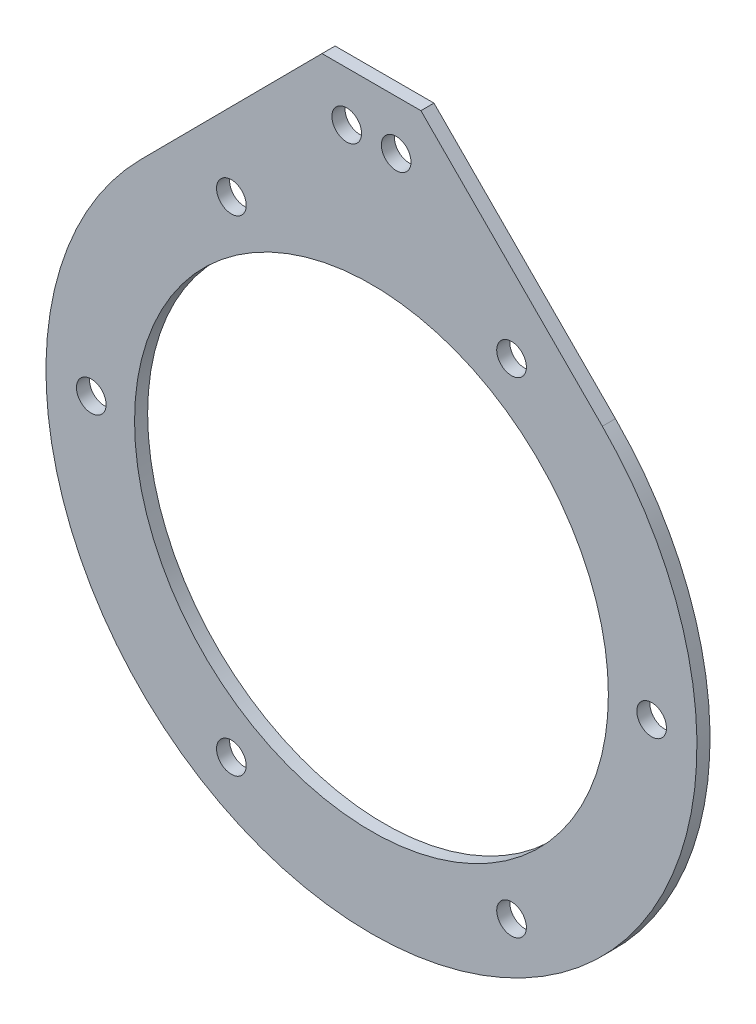
ISO-10303-21;
HEADER;
FILE_DESCRIPTION(('STEP AP214'),'2;1');
FILE_NAME('part.step','',(''),(''),'','','');
FILE_SCHEMA(('AUTOMOTIVE_DESIGN { 1 0 10303 214 1 1 1 1 }'));
ENDSEC;
DATA;
#1=APPLICATION_CONTEXT('core data for automotive mechanical design processes');
#2=APPLICATION_PROTOCOL_DEFINITION('international standard','automotive_design',2000,#1);
#3=PRODUCT_CONTEXT('',#1,'mechanical');
#4=PRODUCT('Part','Part','',(#3));
#5=PRODUCT_RELATED_PRODUCT_CATEGORY('part','',(#4));
#6=PRODUCT_DEFINITION_FORMATION('','',#4);
#7=PRODUCT_DEFINITION_CONTEXT('part definition',#1,'design');
#8=PRODUCT_DEFINITION('design','',#6,#7);
#9=PRODUCT_DEFINITION_SHAPE('','',#8);
#10=(LENGTH_UNIT() NAMED_UNIT(*) SI_UNIT(.MILLI.,.METRE.));
#11=(NAMED_UNIT(*) PLANE_ANGLE_UNIT() SI_UNIT($,.RADIAN.));
#12=(NAMED_UNIT(*) SI_UNIT($,.STERADIAN.) SOLID_ANGLE_UNIT());
#13=UNCERTAINTY_MEASURE_WITH_UNIT(LENGTH_MEASURE(1.E-05),#10,'distance_accuracy_value','');
#14=(GEOMETRIC_REPRESENTATION_CONTEXT(3) GLOBAL_UNCERTAINTY_ASSIGNED_CONTEXT((#13)) GLOBAL_UNIT_ASSIGNED_CONTEXT((#10,
#11,#12)) REPRESENTATION_CONTEXT('',''));
#15=CARTESIAN_POINT('',(0.,0.,0.));
#16=DIRECTION('',(0.,0.,1.));
#17=DIRECTION('',(1.,0.,0.));
#18=AXIS2_PLACEMENT_3D('',#15,#16,#17);
#19=CARTESIAN_POINT('',(0.,0.,0.79375));
#20=DIRECTION('',(0.,0.,-1.));
#21=DIRECTION('',(-1.,0.,0.));
#22=AXIS2_PLACEMENT_3D('',#19,#20,#21);
#23=CYLINDRICAL_SURFACE('',#22,39.5);
#24=CARTESIAN_POINT('',(0.,0.,0.79375));
#25=DIRECTION('',(0.,0.,1.));
#26=DIRECTION('',(1.,0.,0.));
#27=AXIS2_PLACEMENT_3D('',#24,#25,#26);
#28=CIRCLE('',#27,39.5);
#29=CARTESIAN_POINT('',(-28.0183634295652,27.8427963884522,0.79375));
#30=VERTEX_POINT('',#29);
#31=CARTESIAN_POINT('',(28.0183634295651,27.8427963884522,0.79375));
#32=VERTEX_POINT('',#31);
#33=EDGE_CURVE('E11',#30,#32,#28,.T.);
#34=ORIENTED_EDGE('',*,*,#33,.F.);
#35=DIRECTION('',(0.,0.,1.));
#36=VECTOR('',#35,1.);
#37=CARTESIAN_POINT('',(-28.0183634295651,27.8427963884522,-0.79375));
#38=LINE('',#37,#36);
#39=CARTESIAN_POINT('',(-28.0183634295651,27.8427963884522,-0.79375));
#40=VERTEX_POINT('',#39);
#41=EDGE_CURVE('E131',#40,#30,#38,.T.);
#42=ORIENTED_EDGE('',*,*,#41,.F.);
#43=CARTESIAN_POINT('',(0.,0.,-0.79375));
#44=DIRECTION('',(0.,0.,1.));
#45=DIRECTION('',(1.,0.,0.));
#46=AXIS2_PLACEMENT_3D('',#43,#44,#45);
#47=CIRCLE('',#46,39.5);
#48=CARTESIAN_POINT('',(28.0183634295651,27.8427963884522,-0.79375));
#49=VERTEX_POINT('',#48);
#50=EDGE_CURVE('E55',#40,#49,#47,.T.);
#51=ORIENTED_EDGE('',*,*,#50,.T.);
#52=DIRECTION('',(0.,0.,1.));
#53=VECTOR('',#52,1.);
#54=CARTESIAN_POINT('',(28.0183634295651,27.8427963884522,-0.79375));
#55=LINE('',#54,#53);
#56=EDGE_CURVE('E93',#49,#32,#55,.T.);
#57=ORIENTED_EDGE('',*,*,#56,.T.);
#58=EDGE_LOOP('',(#34,#42,#51,#57));
#59=FACE_BOUND('',#58,.T.);
#60=ADVANCED_FACE('F46',(#59),#23,.T.);
#61=CARTESIAN_POINT('',(0.,0.,0.79375));
#62=DIRECTION('',(0.,0.,1.));
#63=DIRECTION('',(1.,0.,0.));
#64=AXIS2_PLACEMENT_3D('',#61,#62,#63);
#65=PLANE('',#64);
#66=CARTESIAN_POINT('',(-3.,44.,0.79375));
#67=DIRECTION('',(0.,0.,1.));
#68=DIRECTION('',(1.,0.,0.));
#69=AXIS2_PLACEMENT_3D('',#66,#67,#68);
#70=CIRCLE('',#69,1.8);
#71=CARTESIAN_POINT('',(-1.2,44.,0.79375));
#72=VERTEX_POINT('',#71);
#73=EDGE_CURVE('E160',#72,#72,#70,.T.);
#74=ORIENTED_EDGE('',*,*,#73,.F.);
#75=EDGE_LOOP('',(#74));
#76=FACE_BOUND('',#75,.T.);
#77=CARTESIAN_POINT('',(3.,44.,0.79375));
#78=DIRECTION('',(0.,0.,1.));
#79=DIRECTION('',(1.,0.,0.));
#80=AXIS2_PLACEMENT_3D('',#77,#78,#79);
#81=CIRCLE('',#80,1.8);
#82=CARTESIAN_POINT('',(4.8,44.,0.79375));
#83=VERTEX_POINT('',#82);
#84=EDGE_CURVE('E143',#83,#83,#81,.T.);
#85=ORIENTED_EDGE('',*,*,#84,.F.);
#86=EDGE_LOOP('',(#85));
#87=FACE_BOUND('',#86,.T.);
#88=CARTESIAN_POINT('',(-16.9999999999996,-29.4448637286711,0.79375));
#89=DIRECTION('',(0.,0.,1.));
#90=DIRECTION('',(1.,0.,0.));
#91=AXIS2_PLACEMENT_3D('',#88,#89,#90);
#92=CIRCLE('',#91,1.8);
#93=CARTESIAN_POINT('',(-15.1999999999996,-29.4448637286711,0.79375));
#94=VERTEX_POINT('',#93);
#95=EDGE_CURVE('E142',#94,#94,#92,.T.);
#96=ORIENTED_EDGE('',*,*,#95,.F.);
#97=EDGE_LOOP('',(#96));
#98=FACE_BOUND('',#97,.T.);
#99=CARTESIAN_POINT('',(-34.,-3.6949610038306E-13,0.79375));
#100=DIRECTION('',(0.,0.,1.));
#101=DIRECTION('',(1.,0.,0.));
#102=AXIS2_PLACEMENT_3D('',#99,#100,#101);
#103=CIRCLE('',#102,1.8);
#104=CARTESIAN_POINT('',(-32.2,-3.6949610038306E-13,0.79375));
#105=VERTEX_POINT('',#104);
#106=EDGE_CURVE('E165',#105,#105,#103,.T.);
#107=ORIENTED_EDGE('',*,*,#106,.F.);
#108=EDGE_LOOP('',(#107));
#109=FACE_BOUND('',#108,.T.);
#110=CARTESIAN_POINT('',(-17.,29.4448637286709,0.79375));
#111=DIRECTION('',(0.,0.,1.));
#112=DIRECTION('',(1.,0.,0.));
#113=AXIS2_PLACEMENT_3D('',#110,#111,#112);
#114=CIRCLE('',#113,1.8);
#115=CARTESIAN_POINT('',(-15.2000000000001,29.4448637286709,0.79375));
#116=VERTEX_POINT('',#115);
#117=EDGE_CURVE('E173',#116,#116,#114,.T.);
#118=ORIENTED_EDGE('',*,*,#117,.F.);
#119=EDGE_LOOP('',(#118));
#120=FACE_BOUND('',#119,.T.);
#121=CARTESIAN_POINT('',(16.9999999999998,29.444863728671,0.79375));
#122=DIRECTION('',(0.,0.,1.));
#123=DIRECTION('',(1.,0.,0.));
#124=AXIS2_PLACEMENT_3D('',#121,#122,#123);
#125=CIRCLE('',#124,1.8);
#126=CARTESIAN_POINT('',(18.7999999999998,29.444863728671,0.79375));
#127=VERTEX_POINT('',#126);
#128=EDGE_CURVE('E180',#127,#127,#125,.T.);
#129=ORIENTED_EDGE('',*,*,#128,.F.);
#130=EDGE_LOOP('',(#129));
#131=FACE_BOUND('',#130,.T.);
#132=CARTESIAN_POINT('',(34.,1.31838984174237E-13,0.79375));
#133=DIRECTION('',(0.,0.,1.));
#134=DIRECTION('',(1.,0.,0.));
#135=AXIS2_PLACEMENT_3D('',#132,#133,#134);
#136=CIRCLE('',#135,1.8);
#137=CARTESIAN_POINT('',(35.8,1.31838984174237E-13,0.79375));
#138=VERTEX_POINT('',#137);
#139=EDGE_CURVE('E187',#138,#138,#136,.T.);
#140=ORIENTED_EDGE('',*,*,#139,.F.);
#141=EDGE_LOOP('',(#140));
#142=FACE_BOUND('',#141,.T.);
#143=CARTESIAN_POINT('',(17.,-29.4448637286709,0.79375));
#144=DIRECTION('',(0.,0.,1.));
#145=DIRECTION('',(1.,0.,0.));
#146=AXIS2_PLACEMENT_3D('',#143,#144,#145);
#147=CIRCLE('',#146,1.8);
#148=CARTESIAN_POINT('',(18.8000000000001,-29.4448637286709,0.79375));
#149=VERTEX_POINT('',#148);
#150=EDGE_CURVE('E195',#149,#149,#147,.T.);
#151=ORIENTED_EDGE('',*,*,#150,.F.);
#152=EDGE_LOOP('',(#151));
#153=FACE_BOUND('',#152,.T.);
#154=CARTESIAN_POINT('',(0.,0.,0.79375));
#155=DIRECTION('',(0.,0.,1.));
#156=DIRECTION('',(1.,0.,0.));
#157=AXIS2_PLACEMENT_3D('',#154,#155,#156);
#158=CIRCLE('',#157,28.75);
#159=CARTESIAN_POINT('',(28.75,0.,0.79375));
#160=VERTEX_POINT('',#159);
#161=EDGE_CURVE('E120',#160,#160,#158,.T.);
#162=ORIENTED_EDGE('',*,*,#161,.F.);
#163=EDGE_LOOP('',(#162));
#164=FACE_BOUND('',#163,.T.);
#165=ORIENTED_EDGE('',*,*,#33,.T.);
#166=DIRECTION('',(-0.704880921226637,0.709325656444688,0.));
#167=VECTOR('',#166,1.);
#168=CARTESIAN_POINT('',(28.0183634295651,27.8427963884522,0.79375));
#169=LINE('',#168,#167);
#170=CARTESIAN_POINT('',(6.,50.,0.79375));
#171=VERTEX_POINT('',#170);
#172=EDGE_CURVE('E125',#32,#171,#169,.T.);
#173=ORIENTED_EDGE('',*,*,#172,.T.);
#174=DIRECTION('',(-1.,0.,0.));
#175=VECTOR('',#174,1.);
#176=CARTESIAN_POINT('',(-6.,50.,0.79375));
#177=LINE('',#176,#175);
#178=CARTESIAN_POINT('',(-6.,50.,0.79375));
#179=VERTEX_POINT('',#178);
#180=EDGE_CURVE('E100',#171,#179,#177,.T.);
#181=ORIENTED_EDGE('',*,*,#180,.T.);
#182=DIRECTION('',(-0.704880921226637,-0.709325656444688,0.));
#183=VECTOR('',#182,1.);
#184=CARTESIAN_POINT('',(-28.0183634295651,27.8427963884522,0.79375));
#185=LINE('',#184,#183);
#186=EDGE_CURVE('E62',#179,#30,#185,.T.);
#187=ORIENTED_EDGE('',*,*,#186,.T.);
#188=EDGE_LOOP('',(#165,#173,#181,#187));
#189=FACE_BOUND('',#188,.T.);
#190=ADVANCED_FACE('F215',(#76,#87,#98,#109,#120,#131,#142,#153,#164,#189),#65,.T.);
#191=CARTESIAN_POINT('',(0.,0.,-0.79375));
#192=DIRECTION('',(0.,0.,1.));
#193=DIRECTION('',(1.,0.,0.));
#194=AXIS2_PLACEMENT_3D('',#191,#192,#193);
#195=PLANE('',#194);
#196=CARTESIAN_POINT('',(-3.,44.,-0.79375));
#197=DIRECTION('',(0.,0.,1.));
#198=DIRECTION('',(1.,0.,0.));
#199=AXIS2_PLACEMENT_3D('',#196,#197,#198);
#200=CIRCLE('',#199,1.8);
#201=CARTESIAN_POINT('',(-1.2,44.,-0.79375));
#202=VERTEX_POINT('',#201);
#203=EDGE_CURVE('E49',#202,#202,#200,.T.);
#204=ORIENTED_EDGE('',*,*,#203,.T.);
#205=EDGE_LOOP('',(#204));
#206=FACE_BOUND('',#205,.T.);
#207=CARTESIAN_POINT('',(3.,44.,-0.79375));
#208=DIRECTION('',(0.,0.,1.));
#209=DIRECTION('',(1.,0.,0.));
#210=AXIS2_PLACEMENT_3D('',#207,#208,#209);
#211=CIRCLE('',#210,1.8);
#212=CARTESIAN_POINT('',(4.8,44.,-0.79375));
#213=VERTEX_POINT('',#212);
#214=EDGE_CURVE('E139',#213,#213,#211,.T.);
#215=ORIENTED_EDGE('',*,*,#214,.T.);
#216=EDGE_LOOP('',(#215));
#217=FACE_BOUND('',#216,.T.);
#218=CARTESIAN_POINT('',(-16.9999999999996,-29.4448637286711,-0.79375));
#219=DIRECTION('',(0.,0.,1.));
#220=DIRECTION('',(1.,0.,0.));
#221=AXIS2_PLACEMENT_3D('',#218,#219,#220);
#222=CIRCLE('',#221,1.8);
#223=CARTESIAN_POINT('',(-15.1999999999996,-29.4448637286711,-0.79375));
#224=VERTEX_POINT('',#223);
#225=EDGE_CURVE('E150',#224,#224,#222,.T.);
#226=ORIENTED_EDGE('',*,*,#225,.T.);
#227=EDGE_LOOP('',(#226));
#228=FACE_BOUND('',#227,.T.);
#229=CARTESIAN_POINT('',(-34.,-3.6949610038306E-13,-0.79375));
#230=DIRECTION('',(0.,0.,1.));
#231=DIRECTION('',(1.,0.,0.));
#232=AXIS2_PLACEMENT_3D('',#229,#230,#231);
#233=CIRCLE('',#232,1.8);
#234=CARTESIAN_POINT('',(-32.2,-3.6949610038306E-13,-0.79375));
#235=VERTEX_POINT('',#234);
#236=EDGE_CURVE('E169',#235,#235,#233,.T.);
#237=ORIENTED_EDGE('',*,*,#236,.T.);
#238=EDGE_LOOP('',(#237));
#239=FACE_BOUND('',#238,.T.);
#240=CARTESIAN_POINT('',(-17.,29.4448637286709,-0.79375));
#241=DIRECTION('',(0.,0.,1.));
#242=DIRECTION('',(1.,0.,0.));
#243=AXIS2_PLACEMENT_3D('',#240,#241,#242);
#244=CIRCLE('',#243,1.8);
#245=CARTESIAN_POINT('',(-15.2000000000001,29.4448637286709,-0.79375));
#246=VERTEX_POINT('',#245);
#247=EDGE_CURVE('E177',#246,#246,#244,.T.);
#248=ORIENTED_EDGE('',*,*,#247,.T.);
#249=EDGE_LOOP('',(#248));
#250=FACE_BOUND('',#249,.T.);
#251=CARTESIAN_POINT('',(16.9999999999998,29.444863728671,-0.79375));
#252=DIRECTION('',(0.,0.,1.));
#253=DIRECTION('',(1.,0.,0.));
#254=AXIS2_PLACEMENT_3D('',#251,#252,#253);
#255=CIRCLE('',#254,1.8);
#256=CARTESIAN_POINT('',(18.7999999999998,29.444863728671,-0.79375));
#257=VERTEX_POINT('',#256);
#258=EDGE_CURVE('E183',#257,#257,#255,.T.);
#259=ORIENTED_EDGE('',*,*,#258,.T.);
#260=EDGE_LOOP('',(#259));
#261=FACE_BOUND('',#260,.T.);
#262=CARTESIAN_POINT('',(34.,1.31838984174237E-13,-0.79375));
#263=DIRECTION('',(0.,0.,1.));
#264=DIRECTION('',(1.,0.,0.));
#265=AXIS2_PLACEMENT_3D('',#262,#263,#264);
#266=CIRCLE('',#265,1.8);
#267=CARTESIAN_POINT('',(35.8,1.31838984174237E-13,-0.79375));
#268=VERTEX_POINT('',#267);
#269=EDGE_CURVE('E191',#268,#268,#266,.T.);
#270=ORIENTED_EDGE('',*,*,#269,.T.);
#271=EDGE_LOOP('',(#270));
#272=FACE_BOUND('',#271,.T.);
#273=CARTESIAN_POINT('',(17.,-29.4448637286709,-0.79375));
#274=DIRECTION('',(0.,0.,1.));
#275=DIRECTION('',(1.,0.,0.));
#276=AXIS2_PLACEMENT_3D('',#273,#274,#275);
#277=CIRCLE('',#276,1.8);
#278=CARTESIAN_POINT('',(18.8000000000001,-29.4448637286709,-0.79375));
#279=VERTEX_POINT('',#278);
#280=EDGE_CURVE('E199',#279,#279,#277,.T.);
#281=ORIENTED_EDGE('',*,*,#280,.T.);
#282=EDGE_LOOP('',(#281));
#283=FACE_BOUND('',#282,.T.);
#284=CARTESIAN_POINT('',(0.,0.,-0.79375));
#285=DIRECTION('',(0.,0.,1.));
#286=DIRECTION('',(1.,0.,0.));
#287=AXIS2_PLACEMENT_3D('',#284,#285,#286);
#288=CIRCLE('',#287,28.75);
#289=CARTESIAN_POINT('',(28.75,0.,-0.79375));
#290=VERTEX_POINT('',#289);
#291=EDGE_CURVE('E128',#290,#290,#288,.T.);
#292=ORIENTED_EDGE('',*,*,#291,.T.);
#293=EDGE_LOOP('',(#292));
#294=FACE_BOUND('',#293,.T.);
#295=ORIENTED_EDGE('',*,*,#50,.F.);
#296=DIRECTION('',(-0.704880921226637,-0.709325656444688,0.));
#297=VECTOR('',#296,1.);
#298=CARTESIAN_POINT('',(-28.0183634295651,27.8427963884522,-0.79375));
#299=LINE('',#298,#297);
#300=CARTESIAN_POINT('',(-6.,50.,-0.79375));
#301=VERTEX_POINT('',#300);
#302=EDGE_CURVE('E70',#301,#40,#299,.T.);
#303=ORIENTED_EDGE('',*,*,#302,.F.);
#304=DIRECTION('',(-1.,0.,0.));
#305=VECTOR('',#304,1.);
#306=CARTESIAN_POINT('',(-6.,50.,-0.79375));
#307=LINE('',#306,#305);
#308=CARTESIAN_POINT('',(6.,50.,-0.79375));
#309=VERTEX_POINT('',#308);
#310=EDGE_CURVE('E99',#309,#301,#307,.T.);
#311=ORIENTED_EDGE('',*,*,#310,.F.);
#312=DIRECTION('',(-0.704880921226637,0.709325656444688,0.));
#313=VECTOR('',#312,1.);
#314=CARTESIAN_POINT('',(28.0183634295651,27.8427963884522,-0.79375));
#315=LINE('',#314,#313);
#316=EDGE_CURVE('E107',#49,#309,#315,.T.);
#317=ORIENTED_EDGE('',*,*,#316,.F.);
#318=EDGE_LOOP('',(#295,#303,#311,#317));
#319=FACE_BOUND('',#318,.T.);
#320=ADVANCED_FACE('F106',(#206,#217,#228,#239,#250,#261,#272,#283,#294,#319),#195,.F.);
#321=CARTESIAN_POINT('',(-28.0183634295651,27.8427963884522,-0.79375));
#322=DIRECTION('',(-0.709325656444688,0.704880921226637,0.));
#323=DIRECTION('',(-0.704880921226637,-0.709325656444688,0.));
#324=AXIS2_PLACEMENT_3D('',#321,#322,#323);
#325=PLANE('',#324);
#326=ORIENTED_EDGE('',*,*,#186,.F.);
#327=DIRECTION('',(0.,0.,1.));
#328=VECTOR('',#327,1.);
#329=CARTESIAN_POINT('',(-6.,50.,-0.79375));
#330=LINE('',#329,#328);
#331=EDGE_CURVE('E87',#301,#179,#330,.T.);
#332=ORIENTED_EDGE('',*,*,#331,.F.);
#333=ORIENTED_EDGE('',*,*,#302,.T.);
#334=ORIENTED_EDGE('',*,*,#41,.T.);
#335=EDGE_LOOP('',(#326,#332,#333,#334));
#336=FACE_BOUND('',#335,.T.);
#337=ADVANCED_FACE('F221',(#336),#325,.T.);
#338=CARTESIAN_POINT('',(-6.,50.,-0.79375));
#339=DIRECTION('',(0.,1.,0.));
#340=DIRECTION('',(0.,0.,1.));
#341=AXIS2_PLACEMENT_3D('',#338,#339,#340);
#342=PLANE('',#341);
#343=ORIENTED_EDGE('',*,*,#180,.F.);
#344=DIRECTION('',(0.,0.,1.));
#345=VECTOR('',#344,1.);
#346=CARTESIAN_POINT('',(6.,50.,-0.79375));
#347=LINE('',#346,#345);
#348=EDGE_CURVE('E96',#309,#171,#347,.T.);
#349=ORIENTED_EDGE('',*,*,#348,.F.);
#350=ORIENTED_EDGE('',*,*,#310,.T.);
#351=ORIENTED_EDGE('',*,*,#331,.T.);
#352=EDGE_LOOP('',(#343,#349,#350,#351));
#353=FACE_BOUND('',#352,.T.);
#354=ADVANCED_FACE('F98',(#353),#342,.T.);
#355=CARTESIAN_POINT('',(28.0183634295651,27.8427963884522,-0.79375));
#356=DIRECTION('',(0.709325656444688,0.704880921226637,0.));
#357=DIRECTION('',(-0.704880921226637,0.709325656444688,0.));
#358=AXIS2_PLACEMENT_3D('',#355,#356,#357);
#359=PLANE('',#358);
#360=ORIENTED_EDGE('',*,*,#172,.F.);
#361=ORIENTED_EDGE('',*,*,#56,.F.);
#362=ORIENTED_EDGE('',*,*,#316,.T.);
#363=ORIENTED_EDGE('',*,*,#348,.T.);
#364=EDGE_LOOP('',(#360,#361,#362,#363));
#365=FACE_BOUND('',#364,.T.);
#366=ADVANCED_FACE('F111',(#365),#359,.T.);
#367=CARTESIAN_POINT('',(0.,0.,-0.79375));
#368=DIRECTION('',(0.,0.,1.));
#369=DIRECTION('',(1.,0.,0.));
#370=AXIS2_PLACEMENT_3D('',#367,#368,#369);
#371=CYLINDRICAL_SURFACE('',#370,28.75);
#372=ORIENTED_EDGE('',*,*,#291,.F.);
#373=EDGE_LOOP('',(#372));
#374=FACE_BOUND('',#373,.T.);
#375=ORIENTED_EDGE('',*,*,#161,.T.);
#376=EDGE_LOOP('',(#375));
#377=FACE_BOUND('',#376,.T.);
#378=ADVANCED_FACE('F213',(#374,#377),#371,.F.);
#379=CARTESIAN_POINT('',(17.,-29.4448637286709,0.79375));
#380=DIRECTION('',(0.,0.,1.));
#381=DIRECTION('',(1.,0.,0.));
#382=AXIS2_PLACEMENT_3D('',#379,#380,#381);
#383=CYLINDRICAL_SURFACE('',#382,1.8);
#384=ORIENTED_EDGE('',*,*,#280,.F.);
#385=EDGE_LOOP('',(#384));
#386=FACE_BOUND('',#385,.T.);
#387=ORIENTED_EDGE('',*,*,#150,.T.);
#388=EDGE_LOOP('',(#387));
#389=FACE_BOUND('',#388,.T.);
#390=ADVANCED_FACE('F263',(#386,#389),#383,.F.);
#391=CARTESIAN_POINT('',(34.,1.31838984174237E-13,0.79375));
#392=DIRECTION('',(0.,0.,1.));
#393=DIRECTION('',(1.,0.,0.));
#394=AXIS2_PLACEMENT_3D('',#391,#392,#393);
#395=CYLINDRICAL_SURFACE('',#394,1.8);
#396=ORIENTED_EDGE('',*,*,#269,.F.);
#397=EDGE_LOOP('',(#396));
#398=FACE_BOUND('',#397,.T.);
#399=ORIENTED_EDGE('',*,*,#139,.T.);
#400=EDGE_LOOP('',(#399));
#401=FACE_BOUND('',#400,.T.);
#402=ADVANCED_FACE('F271',(#398,#401),#395,.F.);
#403=CARTESIAN_POINT('',(16.9999999999998,29.444863728671,0.79375));
#404=DIRECTION('',(0.,0.,1.));
#405=DIRECTION('',(1.,0.,0.));
#406=AXIS2_PLACEMENT_3D('',#403,#404,#405);
#407=CYLINDRICAL_SURFACE('',#406,1.8);
#408=ORIENTED_EDGE('',*,*,#258,.F.);
#409=EDGE_LOOP('',(#408));
#410=FACE_BOUND('',#409,.T.);
#411=ORIENTED_EDGE('',*,*,#128,.T.);
#412=EDGE_LOOP('',(#411));
#413=FACE_BOUND('',#412,.T.);
#414=ADVANCED_FACE('F280',(#410,#413),#407,.F.);
#415=CARTESIAN_POINT('',(-17.,29.4448637286709,0.79375));
#416=DIRECTION('',(0.,0.,1.));
#417=DIRECTION('',(1.,0.,0.));
#418=AXIS2_PLACEMENT_3D('',#415,#416,#417);
#419=CYLINDRICAL_SURFACE('',#418,1.8);
#420=ORIENTED_EDGE('',*,*,#247,.F.);
#421=EDGE_LOOP('',(#420));
#422=FACE_BOUND('',#421,.T.);
#423=ORIENTED_EDGE('',*,*,#117,.T.);
#424=EDGE_LOOP('',(#423));
#425=FACE_BOUND('',#424,.T.);
#426=ADVANCED_FACE('F289',(#422,#425),#419,.F.);
#427=CARTESIAN_POINT('',(-34.,-3.6949610038306E-13,0.79375));
#428=DIRECTION('',(0.,0.,1.));
#429=DIRECTION('',(1.,0.,0.));
#430=AXIS2_PLACEMENT_3D('',#427,#428,#429);
#431=CYLINDRICAL_SURFACE('',#430,1.8);
#432=ORIENTED_EDGE('',*,*,#236,.F.);
#433=EDGE_LOOP('',(#432));
#434=FACE_BOUND('',#433,.T.);
#435=ORIENTED_EDGE('',*,*,#106,.T.);
#436=EDGE_LOOP('',(#435));
#437=FACE_BOUND('',#436,.T.);
#438=ADVANCED_FACE('F298',(#434,#437),#431,.F.);
#439=CARTESIAN_POINT('',(-16.9999999999996,-29.4448637286711,0.79375));
#440=DIRECTION('',(0.,0.,1.));
#441=DIRECTION('',(1.,0.,0.));
#442=AXIS2_PLACEMENT_3D('',#439,#440,#441);
#443=CYLINDRICAL_SURFACE('',#442,1.8);
#444=ORIENTED_EDGE('',*,*,#225,.F.);
#445=EDGE_LOOP('',(#444));
#446=FACE_BOUND('',#445,.T.);
#447=ORIENTED_EDGE('',*,*,#95,.T.);
#448=EDGE_LOOP('',(#447));
#449=FACE_BOUND('',#448,.T.);
#450=ADVANCED_FACE('F307',(#446,#449),#443,.F.);
#451=CARTESIAN_POINT('',(3.,44.,0.79375));
#452=DIRECTION('',(0.,0.,1.));
#453=DIRECTION('',(1.,0.,0.));
#454=AXIS2_PLACEMENT_3D('',#451,#452,#453);
#455=CYLINDRICAL_SURFACE('',#454,1.8);
#456=ORIENTED_EDGE('',*,*,#84,.T.);
#457=EDGE_LOOP('',(#456));
#458=FACE_BOUND('',#457,.T.);
#459=ORIENTED_EDGE('',*,*,#214,.F.);
#460=EDGE_LOOP('',(#459));
#461=FACE_BOUND('',#460,.T.);
#462=ADVANCED_FACE('F316',(#458,#461),#455,.F.);
#463=CARTESIAN_POINT('',(-3.,44.,0.79375));
#464=DIRECTION('',(0.,0.,1.));
#465=DIRECTION('',(1.,0.,0.));
#466=AXIS2_PLACEMENT_3D('',#463,#464,#465);
#467=CYLINDRICAL_SURFACE('',#466,1.8);
#468=ORIENTED_EDGE('',*,*,#73,.T.);
#469=EDGE_LOOP('',(#468));
#470=FACE_BOUND('',#469,.T.);
#471=ORIENTED_EDGE('',*,*,#203,.F.);
#472=EDGE_LOOP('',(#471));
#473=FACE_BOUND('',#472,.T.);
#474=ADVANCED_FACE('F324',(#470,#473),#467,.F.);
#475=CLOSED_SHELL('',(#60,#190,#320,#337,#354,#366,#378,#390,#402,#414,#426,#438,#450,#462,#474));
#476=MANIFOLD_SOLID_BREP('B2',#475);
#477=ADVANCED_BREP_SHAPE_REPRESENTATION('',(#18,#476),#14);
#478=SHAPE_DEFINITION_REPRESENTATION(#9,#477);
ENDSEC;
END-ISO-10303-21;
